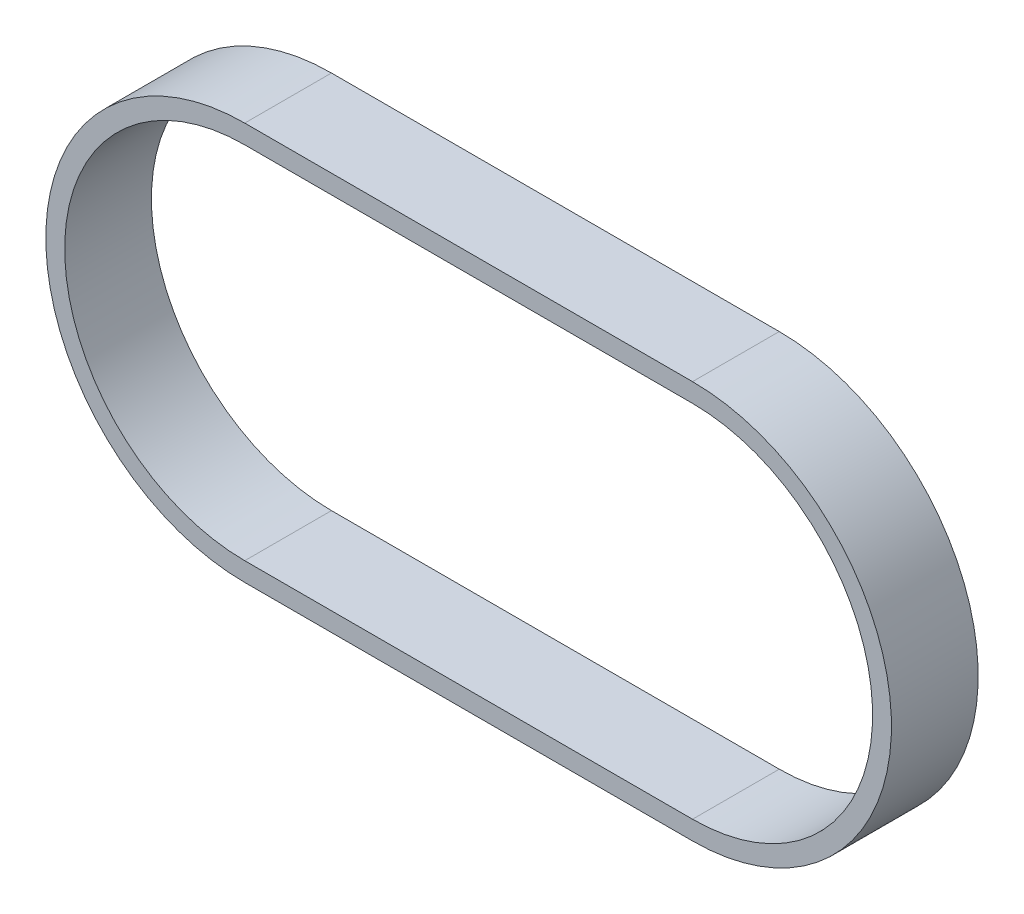
ISO-10303-21;
HEADER;
FILE_DESCRIPTION(('STEP AP214'),'2;1');
FILE_NAME('part.step','',(''),(''),'','','');
FILE_SCHEMA(('AUTOMOTIVE_DESIGN { 1 0 10303 214 1 1 1 1 }'));
ENDSEC;
DATA;
#1=APPLICATION_CONTEXT('core data for automotive mechanical design processes');
#2=APPLICATION_PROTOCOL_DEFINITION('international standard','automotive_design',2000,#1);
#3=PRODUCT_CONTEXT('',#1,'mechanical');
#4=PRODUCT('Part','Part','',(#3));
#5=PRODUCT_RELATED_PRODUCT_CATEGORY('part','',(#4));
#6=PRODUCT_DEFINITION_FORMATION('','',#4);
#7=PRODUCT_DEFINITION_CONTEXT('part definition',#1,'design');
#8=PRODUCT_DEFINITION('design','',#6,#7);
#9=PRODUCT_DEFINITION_SHAPE('','',#8);
#10=(LENGTH_UNIT() NAMED_UNIT(*) SI_UNIT(.MILLI.,.METRE.));
#11=(NAMED_UNIT(*) PLANE_ANGLE_UNIT() SI_UNIT($,.RADIAN.));
#12=(NAMED_UNIT(*) SI_UNIT($,.STERADIAN.) SOLID_ANGLE_UNIT());
#13=UNCERTAINTY_MEASURE_WITH_UNIT(LENGTH_MEASURE(1.E-05),#10,'distance_accuracy_value','');
#14=(GEOMETRIC_REPRESENTATION_CONTEXT(3) GLOBAL_UNCERTAINTY_ASSIGNED_CONTEXT((#13)) GLOBAL_UNIT_ASSIGNED_CONTEXT((#10,
#11,#12)) REPRESENTATION_CONTEXT('',''));
#15=CARTESIAN_POINT('',(0.,0.,0.));
#16=DIRECTION('',(0.,0.,1.));
#17=DIRECTION('',(1.,0.,0.));
#18=AXIS2_PLACEMENT_3D('',#15,#16,#17);
#19=CARTESIAN_POINT('',(0.,0.,9.2));
#20=DIRECTION('',(0.,0.,1.));
#21=DIRECTION('',(1.,0.,0.));
#22=AXIS2_PLACEMENT_3D('',#19,#20,#21);
#23=PLANE('',#22);
#24=CARTESIAN_POINT('',(0.,0.,9.2));
#25=DIRECTION('',(0.,0.,1.));
#26=DIRECTION('',(1.,0.,0.));
#27=AXIS2_PLACEMENT_3D('',#24,#25,#26);
#28=CIRCLE('',#27,21.1);
#29=CARTESIAN_POINT('',(0.,21.1,9.2));
#30=VERTEX_POINT('',#29);
#31=CARTESIAN_POINT('',(0.,-21.1,9.2));
#32=VERTEX_POINT('',#31);
#33=EDGE_CURVE('E158',#30,#32,#28,.T.);
#34=ORIENTED_EDGE('',*,*,#33,.T.);
#35=DIRECTION('',(1.,0.,0.));
#36=VECTOR('',#35,1.);
#37=CARTESIAN_POINT('',(0.,-21.1,9.2));
#38=LINE('',#37,#36);
#39=CARTESIAN_POINT('',(47.5,-21.1,9.2));
#40=VERTEX_POINT('',#39);
#41=EDGE_CURVE('E161',#32,#40,#38,.T.);
#42=ORIENTED_EDGE('',*,*,#41,.T.);
#43=CARTESIAN_POINT('',(47.5,0.,9.2));
#44=DIRECTION('',(0.,0.,1.));
#45=DIRECTION('',(1.,0.,0.));
#46=AXIS2_PLACEMENT_3D('',#43,#44,#45);
#47=CIRCLE('',#46,21.1);
#48=CARTESIAN_POINT('',(47.5,21.1,9.2));
#49=VERTEX_POINT('',#48);
#50=EDGE_CURVE('E164',#40,#49,#47,.T.);
#51=ORIENTED_EDGE('',*,*,#50,.T.);
#52=DIRECTION('',(-1.,0.,0.));
#53=VECTOR('',#52,1.);
#54=CARTESIAN_POINT('',(0.,21.1,9.2));
#55=LINE('',#54,#53);
#56=EDGE_CURVE('E166',#49,#30,#55,.T.);
#57=ORIENTED_EDGE('',*,*,#56,.T.);
#58=EDGE_LOOP('',(#34,#42,#51,#57));
#59=FACE_BOUND('',#58,.T.);
#60=DIRECTION('',(1.,0.,0.));
#61=VECTOR('',#60,1.);
#62=CARTESIAN_POINT('',(0.,-19.1,9.2));
#63=LINE('',#62,#61);
#64=CARTESIAN_POINT('',(0.,-19.1,9.2));
#65=VERTEX_POINT('',#64);
#66=CARTESIAN_POINT('',(47.5,-19.1,9.2));
#67=VERTEX_POINT('',#66);
#68=EDGE_CURVE('E130',#65,#67,#63,.T.);
#69=ORIENTED_EDGE('',*,*,#68,.F.);
#70=CARTESIAN_POINT('',(0.,0.,9.2));
#71=DIRECTION('',(0.,0.,1.));
#72=DIRECTION('',(1.,0.,0.));
#73=AXIS2_PLACEMENT_3D('',#70,#71,#72);
#74=CIRCLE('',#73,19.1);
#75=CARTESIAN_POINT('',(0.,19.1,9.2));
#76=VERTEX_POINT('',#75);
#77=EDGE_CURVE('E122',#76,#65,#74,.T.);
#78=ORIENTED_EDGE('',*,*,#77,.F.);
#79=DIRECTION('',(-1.,0.,0.));
#80=VECTOR('',#79,1.);
#81=CARTESIAN_POINT('',(0.,19.1,9.2));
#82=LINE('',#81,#80);
#83=CARTESIAN_POINT('',(47.5,19.1,9.2));
#84=VERTEX_POINT('',#83);
#85=EDGE_CURVE('E144',#84,#76,#82,.T.);
#86=ORIENTED_EDGE('',*,*,#85,.F.);
#87=CARTESIAN_POINT('',(47.5,0.,9.2));
#88=DIRECTION('',(0.,0.,1.));
#89=DIRECTION('',(1.,0.,0.));
#90=AXIS2_PLACEMENT_3D('',#87,#88,#89);
#91=CIRCLE('',#90,19.1);
#92=EDGE_CURVE('E142',#67,#84,#91,.T.);
#93=ORIENTED_EDGE('',*,*,#92,.F.);
#94=EDGE_LOOP('',(#69,#78,#86,#93));
#95=FACE_BOUND('',#94,.T.);
#96=ADVANCED_FACE('F57',(#59,#95),#23,.T.);
#97=CARTESIAN_POINT('',(0.,0.,0.));
#98=DIRECTION('',(0.,0.,1.));
#99=DIRECTION('',(1.,0.,0.));
#100=AXIS2_PLACEMENT_3D('',#97,#98,#99);
#101=PLANE('',#100);
#102=CARTESIAN_POINT('',(0.,0.,0.));
#103=DIRECTION('',(0.,0.,1.));
#104=DIRECTION('',(1.,0.,0.));
#105=AXIS2_PLACEMENT_3D('',#102,#103,#104);
#106=CIRCLE('',#105,21.1);
#107=CARTESIAN_POINT('',(0.,21.1,0.));
#108=VERTEX_POINT('',#107);
#109=CARTESIAN_POINT('',(0.,-21.1,0.));
#110=VERTEX_POINT('',#109);
#111=EDGE_CURVE('E138',#108,#110,#106,.T.);
#112=ORIENTED_EDGE('',*,*,#111,.F.);
#113=DIRECTION('',(-1.,0.,0.));
#114=VECTOR('',#113,1.);
#115=CARTESIAN_POINT('',(0.,21.1,0.));
#116=LINE('',#115,#114);
#117=CARTESIAN_POINT('',(47.5,21.1,0.));
#118=VERTEX_POINT('',#117);
#119=EDGE_CURVE('E162',#118,#108,#116,.T.);
#120=ORIENTED_EDGE('',*,*,#119,.F.);
#121=CARTESIAN_POINT('',(47.5,0.,0.));
#122=DIRECTION('',(0.,0.,1.));
#123=DIRECTION('',(1.,0.,0.));
#124=AXIS2_PLACEMENT_3D('',#121,#122,#123);
#125=CIRCLE('',#124,21.1);
#126=CARTESIAN_POINT('',(47.5,-21.1,0.));
#127=VERTEX_POINT('',#126);
#128=EDGE_CURVE('E173',#127,#118,#125,.T.);
#129=ORIENTED_EDGE('',*,*,#128,.F.);
#130=DIRECTION('',(1.,0.,0.));
#131=VECTOR('',#130,1.);
#132=CARTESIAN_POINT('',(0.,-21.1,0.));
#133=LINE('',#132,#131);
#134=EDGE_CURVE('E171',#110,#127,#133,.T.);
#135=ORIENTED_EDGE('',*,*,#134,.F.);
#136=EDGE_LOOP('',(#112,#120,#129,#135));
#137=FACE_BOUND('',#136,.T.);
#138=CARTESIAN_POINT('',(0.,0.,0.));
#139=DIRECTION('',(0.,0.,1.));
#140=DIRECTION('',(1.,0.,0.));
#141=AXIS2_PLACEMENT_3D('',#138,#139,#140);
#142=CIRCLE('',#141,19.1);
#143=CARTESIAN_POINT('',(0.,19.1,0.));
#144=VERTEX_POINT('',#143);
#145=CARTESIAN_POINT('',(0.,-19.1,0.));
#146=VERTEX_POINT('',#145);
#147=EDGE_CURVE('E80',#144,#146,#142,.T.);
#148=ORIENTED_EDGE('',*,*,#147,.T.);
#149=DIRECTION('',(1.,0.,0.));
#150=VECTOR('',#149,1.);
#151=CARTESIAN_POINT('',(0.,-19.1,0.));
#152=LINE('',#151,#150);
#153=CARTESIAN_POINT('',(47.5,-19.1,0.));
#154=VERTEX_POINT('',#153);
#155=EDGE_CURVE('E137',#146,#154,#152,.T.);
#156=ORIENTED_EDGE('',*,*,#155,.T.);
#157=CARTESIAN_POINT('',(47.5,0.,0.));
#158=DIRECTION('',(0.,0.,1.));
#159=DIRECTION('',(1.,0.,0.));
#160=AXIS2_PLACEMENT_3D('',#157,#158,#159);
#161=CIRCLE('',#160,19.1);
#162=CARTESIAN_POINT('',(47.5,19.1,0.));
#163=VERTEX_POINT('',#162);
#164=EDGE_CURVE('E150',#154,#163,#161,.T.);
#165=ORIENTED_EDGE('',*,*,#164,.T.);
#166=DIRECTION('',(-1.,0.,0.));
#167=VECTOR('',#166,1.);
#168=CARTESIAN_POINT('',(0.,19.1,0.));
#169=LINE('',#168,#167);
#170=EDGE_CURVE('E131',#163,#144,#169,.T.);
#171=ORIENTED_EDGE('',*,*,#170,.T.);
#172=EDGE_LOOP('',(#148,#156,#165,#171));
#173=FACE_BOUND('',#172,.T.);
#174=ADVANCED_FACE('F191',(#137,#173),#101,.F.);
#175=CARTESIAN_POINT('',(0.,0.,9.2));
#176=DIRECTION('',(0.,0.,-1.));
#177=DIRECTION('',(-1.,0.,0.));
#178=AXIS2_PLACEMENT_3D('',#175,#176,#177);
#179=CYLINDRICAL_SURFACE('',#178,21.1);
#180=ORIENTED_EDGE('',*,*,#111,.T.);
#181=DIRECTION('',(0.,0.,-1.));
#182=VECTOR('',#181,1.);
#183=CARTESIAN_POINT('',(0.,-21.1,9.2));
#184=LINE('',#183,#182);
#185=EDGE_CURVE('E12',#32,#110,#184,.T.);
#186=ORIENTED_EDGE('',*,*,#185,.F.);
#187=ORIENTED_EDGE('',*,*,#33,.F.);
#188=DIRECTION('',(0.,0.,-1.));
#189=VECTOR('',#188,1.);
#190=CARTESIAN_POINT('',(0.,21.1,9.2));
#191=LINE('',#190,#189);
#192=EDGE_CURVE('E168',#30,#108,#191,.T.);
#193=ORIENTED_EDGE('',*,*,#192,.T.);
#194=EDGE_LOOP('',(#180,#186,#187,#193));
#195=FACE_BOUND('',#194,.T.);
#196=ADVANCED_FACE('F59',(#195),#179,.T.);
#197=CARTESIAN_POINT('',(0.,-21.1,9.2));
#198=DIRECTION('',(0.,1.,0.));
#199=DIRECTION('',(-1.,0.,0.));
#200=AXIS2_PLACEMENT_3D('',#197,#198,#199);
#201=PLANE('',#200);
#202=ORIENTED_EDGE('',*,*,#134,.T.);
#203=DIRECTION('',(0.,0.,-1.));
#204=VECTOR('',#203,1.);
#205=CARTESIAN_POINT('',(47.5,-21.1,9.2));
#206=LINE('',#205,#204);
#207=EDGE_CURVE('E65',#40,#127,#206,.T.);
#208=ORIENTED_EDGE('',*,*,#207,.F.);
#209=ORIENTED_EDGE('',*,*,#41,.F.);
#210=ORIENTED_EDGE('',*,*,#185,.T.);
#211=EDGE_LOOP('',(#202,#208,#209,#210));
#212=FACE_BOUND('',#211,.T.);
#213=ADVANCED_FACE('F201',(#212),#201,.F.);
#214=CARTESIAN_POINT('',(47.5,0.,9.2));
#215=DIRECTION('',(0.,0.,-1.));
#216=DIRECTION('',(-1.,0.,0.));
#217=AXIS2_PLACEMENT_3D('',#214,#215,#216);
#218=CYLINDRICAL_SURFACE('',#217,21.1);
#219=ORIENTED_EDGE('',*,*,#128,.T.);
#220=DIRECTION('',(0.,0.,-1.));
#221=VECTOR('',#220,1.);
#222=CARTESIAN_POINT('',(47.5,21.1,9.2));
#223=LINE('',#222,#221);
#224=EDGE_CURVE('E178',#49,#118,#223,.T.);
#225=ORIENTED_EDGE('',*,*,#224,.F.);
#226=ORIENTED_EDGE('',*,*,#50,.F.);
#227=ORIENTED_EDGE('',*,*,#207,.T.);
#228=EDGE_LOOP('',(#219,#225,#226,#227));
#229=FACE_BOUND('',#228,.T.);
#230=ADVANCED_FACE('F185',(#229),#218,.T.);
#231=CARTESIAN_POINT('',(0.,21.1,9.2));
#232=DIRECTION('',(0.,-1.,0.));
#233=DIRECTION('',(1.,0.,0.));
#234=AXIS2_PLACEMENT_3D('',#231,#232,#233);
#235=PLANE('',#234);
#236=ORIENTED_EDGE('',*,*,#119,.T.);
#237=ORIENTED_EDGE('',*,*,#192,.F.);
#238=ORIENTED_EDGE('',*,*,#56,.F.);
#239=ORIENTED_EDGE('',*,*,#224,.T.);
#240=EDGE_LOOP('',(#236,#237,#238,#239));
#241=FACE_BOUND('',#240,.T.);
#242=ADVANCED_FACE('F195',(#241),#235,.F.);
#243=CARTESIAN_POINT('',(0.,0.,9.2));
#244=DIRECTION('',(0.,0.,-1.));
#245=DIRECTION('',(-1.,0.,0.));
#246=AXIS2_PLACEMENT_3D('',#243,#244,#245);
#247=CYLINDRICAL_SURFACE('',#246,19.1);
#248=ORIENTED_EDGE('',*,*,#147,.F.);
#249=DIRECTION('',(0.,0.,-1.));
#250=VECTOR('',#249,1.);
#251=CARTESIAN_POINT('',(0.,19.1,9.2));
#252=LINE('',#251,#250);
#253=EDGE_CURVE('E126',#76,#144,#252,.T.);
#254=ORIENTED_EDGE('',*,*,#253,.F.);
#255=ORIENTED_EDGE('',*,*,#77,.T.);
#256=DIRECTION('',(0.,0.,-1.));
#257=VECTOR('',#256,1.);
#258=CARTESIAN_POINT('',(0.,-19.1,9.2));
#259=LINE('',#258,#257);
#260=EDGE_CURVE('E125',#65,#146,#259,.T.);
#261=ORIENTED_EDGE('',*,*,#260,.T.);
#262=EDGE_LOOP('',(#248,#254,#255,#261));
#263=FACE_BOUND('',#262,.T.);
#264=ADVANCED_FACE('F124',(#263),#247,.F.);
#265=CARTESIAN_POINT('',(0.,-19.1,9.2));
#266=DIRECTION('',(0.,1.,0.));
#267=DIRECTION('',(-1.,0.,0.));
#268=AXIS2_PLACEMENT_3D('',#265,#266,#267);
#269=PLANE('',#268);
#270=ORIENTED_EDGE('',*,*,#155,.F.);
#271=ORIENTED_EDGE('',*,*,#260,.F.);
#272=ORIENTED_EDGE('',*,*,#68,.T.);
#273=DIRECTION('',(0.,0.,-1.));
#274=VECTOR('',#273,1.);
#275=CARTESIAN_POINT('',(47.5,-19.1,9.2));
#276=LINE('',#275,#274);
#277=EDGE_CURVE('E139',#67,#154,#276,.T.);
#278=ORIENTED_EDGE('',*,*,#277,.T.);
#279=EDGE_LOOP('',(#270,#271,#272,#278));
#280=FACE_BOUND('',#279,.T.);
#281=ADVANCED_FACE('F134',(#280),#269,.T.);
#282=CARTESIAN_POINT('',(47.5,0.,9.2));
#283=DIRECTION('',(0.,0.,-1.));
#284=DIRECTION('',(-1.,0.,0.));
#285=AXIS2_PLACEMENT_3D('',#282,#283,#284);
#286=CYLINDRICAL_SURFACE('',#285,19.1);
#287=ORIENTED_EDGE('',*,*,#164,.F.);
#288=ORIENTED_EDGE('',*,*,#277,.F.);
#289=ORIENTED_EDGE('',*,*,#92,.T.);
#290=DIRECTION('',(0.,0.,-1.));
#291=VECTOR('',#290,1.);
#292=CARTESIAN_POINT('',(47.5,19.1,9.2));
#293=LINE('',#292,#291);
#294=EDGE_CURVE('E72',#84,#163,#293,.T.);
#295=ORIENTED_EDGE('',*,*,#294,.T.);
#296=EDGE_LOOP('',(#287,#288,#289,#295));
#297=FACE_BOUND('',#296,.T.);
#298=ADVANCED_FACE('F224',(#297),#286,.F.);
#299=CARTESIAN_POINT('',(0.,19.1,9.2));
#300=DIRECTION('',(0.,-1.,0.));
#301=DIRECTION('',(1.,0.,0.));
#302=AXIS2_PLACEMENT_3D('',#299,#300,#301);
#303=PLANE('',#302);
#304=ORIENTED_EDGE('',*,*,#170,.F.);
#305=ORIENTED_EDGE('',*,*,#294,.F.);
#306=ORIENTED_EDGE('',*,*,#85,.T.);
#307=ORIENTED_EDGE('',*,*,#253,.T.);
#308=EDGE_LOOP('',(#304,#305,#306,#307));
#309=FACE_BOUND('',#308,.T.);
#310=ADVANCED_FACE('F228',(#309),#303,.T.);
#311=CLOSED_SHELL('',(#96,#174,#196,#213,#230,#242,#264,#281,#298,#310));
#312=MANIFOLD_SOLID_BREP('B2',#311);
#313=ADVANCED_BREP_SHAPE_REPRESENTATION('',(#18,#312),#14);
#314=SHAPE_DEFINITION_REPRESENTATION(#9,#313);
ENDSEC;
END-ISO-10303-21;
